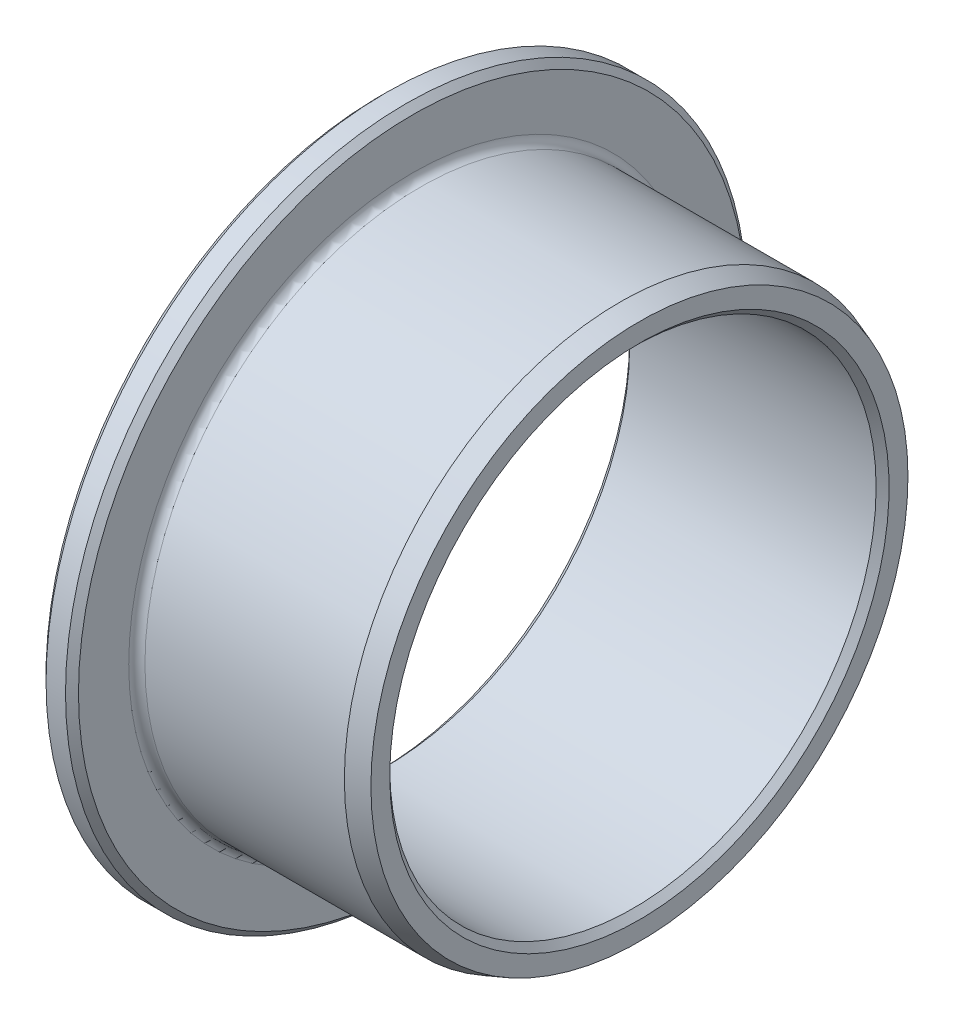
ISO-10303-21;
HEADER;
FILE_DESCRIPTION(('STEP AP214'),'2;1');
FILE_NAME('part.step','',(''),(''),'','','');
FILE_SCHEMA(('AUTOMOTIVE_DESIGN { 1 0 10303 214 1 1 1 1 }'));
ENDSEC;
DATA;
#1=APPLICATION_CONTEXT('core data for automotive mechanical design processes');
#2=APPLICATION_PROTOCOL_DEFINITION('international standard','automotive_design',2000,#1);
#3=PRODUCT_CONTEXT('',#1,'mechanical');
#4=PRODUCT('Part','Part','',(#3));
#5=PRODUCT_RELATED_PRODUCT_CATEGORY('part','',(#4));
#6=PRODUCT_DEFINITION_FORMATION('','',#4);
#7=PRODUCT_DEFINITION_CONTEXT('part definition',#1,'design');
#8=PRODUCT_DEFINITION('design','',#6,#7);
#9=PRODUCT_DEFINITION_SHAPE('','',#8);
#10=(LENGTH_UNIT() NAMED_UNIT(*) SI_UNIT(.MILLI.,.METRE.));
#11=(NAMED_UNIT(*) PLANE_ANGLE_UNIT() SI_UNIT($,.RADIAN.));
#12=(NAMED_UNIT(*) SI_UNIT($,.STERADIAN.) SOLID_ANGLE_UNIT());
#13=UNCERTAINTY_MEASURE_WITH_UNIT(LENGTH_MEASURE(1.E-05),#10,'distance_accuracy_value','');
#14=(GEOMETRIC_REPRESENTATION_CONTEXT(3) GLOBAL_UNCERTAINTY_ASSIGNED_CONTEXT((#13)) GLOBAL_UNIT_ASSIGNED_CONTEXT((#10,
#11,#12)) REPRESENTATION_CONTEXT('',''));
#15=CARTESIAN_POINT('',(0.,0.,0.));
#16=DIRECTION('',(0.,0.,1.));
#17=DIRECTION('',(1.,0.,0.));
#18=AXIS2_PLACEMENT_3D('',#15,#16,#17);
#19=CARTESIAN_POINT('',(0.,21.,0.));
#20=DIRECTION('',(-1.,0.,0.));
#21=DIRECTION('',(0.,0.,1.));
#22=AXIS2_PLACEMENT_3D('',#19,#20,#21);
#23=PLANE('',#22);
#24=CARTESIAN_POINT('',(0.,0.,0.));
#25=DIRECTION('',(-1.,0.,0.));
#26=DIRECTION('',(0.,0.,1.));
#27=AXIS2_PLACEMENT_3D('',#24,#25,#26);
#28=CIRCLE('',#27,20.6);
#29=CARTESIAN_POINT('',(0.,0.,20.6));
#30=VERTEX_POINT('',#29);
#31=EDGE_CURVE('E54',#30,#30,#28,.F.);
#32=ORIENTED_EDGE('',*,*,#31,.T.);
#33=EDGE_LOOP('',(#32));
#34=FACE_BOUND('',#33,.T.);
#35=CARTESIAN_POINT('',(0.,0.,0.));
#36=DIRECTION('',(-1.,0.,0.));
#37=DIRECTION('',(0.,0.,1.));
#38=AXIS2_PLACEMENT_3D('',#35,#36,#37);
#39=CIRCLE('',#38,17.5);
#40=CARTESIAN_POINT('',(0.,0.,17.5));
#41=VERTEX_POINT('',#40);
#42=EDGE_CURVE('E72',#41,#41,#39,.T.);
#43=ORIENTED_EDGE('',*,*,#42,.T.);
#44=EDGE_LOOP('',(#43));
#45=FACE_BOUND('',#44,.T.);
#46=ADVANCED_FACE('F32',(#34,#45),#23,.F.);
#47=CARTESIAN_POINT('',(-5.31268266176283,0.,0.));
#48=DIRECTION('',(-1.,0.,0.));
#49=DIRECTION('',(0.,0.,1.));
#50=AXIS2_PLACEMENT_3D('',#47,#48,#49);
#51=CYLINDRICAL_SURFACE('',#50,17.);
#52=CARTESIAN_POINT('',(12.8,0.,0.));
#53=DIRECTION('',(-1.,0.,0.));
#54=DIRECTION('',(0.,0.,1.));
#55=AXIS2_PLACEMENT_3D('',#52,#53,#54);
#56=CIRCLE('',#55,17.);
#57=CARTESIAN_POINT('',(12.8,0.,17.));
#58=VERTEX_POINT('',#57);
#59=EDGE_CURVE('E38',#58,#58,#56,.T.);
#60=ORIENTED_EDGE('',*,*,#59,.T.);
#61=EDGE_LOOP('',(#60));
#62=FACE_BOUND('',#61,.T.);
#63=CARTESIAN_POINT('',(0.5,0.,0.));
#64=DIRECTION('',(-1.,0.,0.));
#65=DIRECTION('',(0.,0.,1.));
#66=AXIS2_PLACEMENT_3D('',#63,#64,#65);
#67=CIRCLE('',#66,17.);
#68=CARTESIAN_POINT('',(0.5,0.,17.));
#69=VERTEX_POINT('',#68);
#70=EDGE_CURVE('E69',#69,#69,#67,.F.);
#71=ORIENTED_EDGE('',*,*,#70,.T.);
#72=EDGE_LOOP('',(#71));
#73=FACE_BOUND('',#72,.T.);
#74=ADVANCED_FACE('F95',(#62,#73),#51,.T.);
#75=CARTESIAN_POINT('',(14.,17.,0.));
#76=DIRECTION('',(-1.,0.,0.));
#77=DIRECTION('',(0.,0.,1.));
#78=AXIS2_PLACEMENT_3D('',#75,#76,#77);
#79=PLANE('',#78);
#80=CARTESIAN_POINT('',(14.,0.,0.));
#81=DIRECTION('',(-1.,0.,0.));
#82=DIRECTION('',(0.,0.,1.));
#83=AXIS2_PLACEMENT_3D('',#80,#81,#82);
#84=CIRCLE('',#83,16.5632357188806);
#85=CARTESIAN_POINT('',(14.,0.,16.5632357188806));
#86=VERTEX_POINT('',#85);
#87=EDGE_CURVE('E10',#86,#86,#84,.F.);
#88=ORIENTED_EDGE('',*,*,#87,.T.);
#89=EDGE_LOOP('',(#88));
#90=FACE_BOUND('',#89,.T.);
#91=CARTESIAN_POINT('',(14.,0.,0.));
#92=DIRECTION('',(-1.,0.,0.));
#93=DIRECTION('',(0.,0.,1.));
#94=AXIS2_PLACEMENT_3D('',#91,#92,#93);
#95=CIRCLE('',#94,15.4);
#96=CARTESIAN_POINT('',(14.,0.,15.4));
#97=VERTEX_POINT('',#96);
#98=EDGE_CURVE('E51',#97,#97,#95,.T.);
#99=ORIENTED_EDGE('',*,*,#98,.T.);
#100=EDGE_LOOP('',(#99));
#101=FACE_BOUND('',#100,.T.);
#102=ADVANCED_FACE('F100',(#90,#101),#79,.F.);
#103=CARTESIAN_POINT('',(-5.31268266176283,0.,0.));
#104=DIRECTION('',(-1.,0.,0.));
#105=DIRECTION('',(0.,0.,1.));
#106=AXIS2_PLACEMENT_3D('',#103,#104,#105);
#107=CYLINDRICAL_SURFACE('',#106,15.);
#108=CARTESIAN_POINT('',(13.6,0.,0.));
#109=DIRECTION('',(-1.,0.,0.));
#110=DIRECTION('',(0.,0.,1.));
#111=AXIS2_PLACEMENT_3D('',#108,#109,#110);
#112=CIRCLE('',#111,15.);
#113=CARTESIAN_POINT('',(13.6,0.,15.));
#114=VERTEX_POINT('',#113);
#115=EDGE_CURVE('E42',#114,#114,#112,.F.);
#116=ORIENTED_EDGE('',*,*,#115,.T.);
#117=EDGE_LOOP('',(#116));
#118=FACE_BOUND('',#117,.T.);
#119=CARTESIAN_POINT('',(-1.60000000000001,0.,0.));
#120=DIRECTION('',(1.,0.,0.));
#121=DIRECTION('',(0.,0.,-1.));
#122=AXIS2_PLACEMENT_3D('',#119,#120,#121);
#123=CIRCLE('',#122,15.);
#124=CARTESIAN_POINT('',(-1.60000000000001,0.,-15.));
#125=VERTEX_POINT('',#124);
#126=EDGE_CURVE('E46',#125,#125,#123,.F.);
#127=ORIENTED_EDGE('',*,*,#126,.T.);
#128=EDGE_LOOP('',(#127));
#129=FACE_BOUND('',#128,.T.);
#130=ADVANCED_FACE('F161',(#118,#129),#107,.F.);
#131=CARTESIAN_POINT('',(-2.,15.,0.));
#132=DIRECTION('',(1.,0.,0.));
#133=DIRECTION('',(0.,0.,-1.));
#134=AXIS2_PLACEMENT_3D('',#131,#132,#133);
#135=PLANE('',#134);
#136=CARTESIAN_POINT('',(-2.,0.,0.));
#137=DIRECTION('',(1.,0.,0.));
#138=DIRECTION('',(0.,0.,-1.));
#139=AXIS2_PLACEMENT_3D('',#136,#137,#138);
#140=CIRCLE('',#139,20.6);
#141=CARTESIAN_POINT('',(-2.,0.,-20.6));
#142=VERTEX_POINT('',#141);
#143=EDGE_CURVE('E63',#142,#142,#140,.F.);
#144=ORIENTED_EDGE('',*,*,#143,.T.);
#145=EDGE_LOOP('',(#144));
#146=FACE_BOUND('',#145,.T.);
#147=CARTESIAN_POINT('',(-2.,0.,0.));
#148=DIRECTION('',(1.,0.,0.));
#149=DIRECTION('',(0.,0.,-1.));
#150=AXIS2_PLACEMENT_3D('',#147,#148,#149);
#151=CIRCLE('',#150,15.4);
#152=CARTESIAN_POINT('',(-2.,0.,-15.4));
#153=VERTEX_POINT('',#152);
#154=EDGE_CURVE('E66',#153,#153,#151,.T.);
#155=ORIENTED_EDGE('',*,*,#154,.T.);
#156=EDGE_LOOP('',(#155));
#157=FACE_BOUND('',#156,.T.);
#158=ADVANCED_FACE('F90',(#146,#157),#135,.F.);
#159=CARTESIAN_POINT('',(-5.31268266176283,0.,0.));
#160=DIRECTION('',(-1.,0.,0.));
#161=DIRECTION('',(0.,0.,1.));
#162=AXIS2_PLACEMENT_3D('',#159,#160,#161);
#163=CYLINDRICAL_SURFACE('',#162,21.);
#164=CARTESIAN_POINT('',(-1.6,0.,0.));
#165=DIRECTION('',(1.,0.,0.));
#166=DIRECTION('',(0.,0.,-1.));
#167=AXIS2_PLACEMENT_3D('',#164,#165,#166);
#168=CIRCLE('',#167,21.);
#169=CARTESIAN_POINT('',(-1.6,0.,-21.));
#170=VERTEX_POINT('',#169);
#171=EDGE_CURVE('E57',#170,#170,#168,.T.);
#172=ORIENTED_EDGE('',*,*,#171,.T.);
#173=EDGE_LOOP('',(#172));
#174=FACE_BOUND('',#173,.T.);
#175=CARTESIAN_POINT('',(-0.400000000000001,0.,0.));
#176=DIRECTION('',(-1.,0.,0.));
#177=DIRECTION('',(0.,0.,1.));
#178=AXIS2_PLACEMENT_3D('',#175,#176,#177);
#179=CIRCLE('',#178,21.);
#180=CARTESIAN_POINT('',(-0.400000000000001,0.,21.));
#181=VERTEX_POINT('',#180);
#182=EDGE_CURVE('E60',#181,#181,#179,.T.);
#183=ORIENTED_EDGE('',*,*,#182,.T.);
#184=EDGE_LOOP('',(#183));
#185=FACE_BOUND('',#184,.T.);
#186=ADVANCED_FACE('F80',(#174,#185),#163,.T.);
#187=CARTESIAN_POINT('',(0.5,0.,0.));
#188=DIRECTION('',(-1.,0.,0.));
#189=DIRECTION('',(0.,0.,1.));
#190=AXIS2_PLACEMENT_3D('',#187,#188,#189);
#191=TOROIDAL_SURFACE('',#190,17.5,0.5);
#192=ORIENTED_EDGE('',*,*,#70,.F.);
#193=EDGE_LOOP('',(#192));
#194=FACE_BOUND('',#193,.T.);
#195=ORIENTED_EDGE('',*,*,#42,.F.);
#196=EDGE_LOOP('',(#195));
#197=FACE_BOUND('',#196,.T.);
#198=ADVANCED_FACE('F77',(#194,#197),#191,.F.);
#199=CARTESIAN_POINT('',(-2.,0.,0.));
#200=DIRECTION('',(1.,0.,0.));
#201=DIRECTION('',(0.,0.,-1.));
#202=AXIS2_PLACEMENT_3D('',#199,#200,#201);
#203=CONICAL_SURFACE('',#202,20.6,0.78539816339745);
#204=CARTESIAN_POINT('',(-1.6,0.,-21.));
#205=CARTESIAN_POINT('',(-1.60416666666667,0.,-20.9958333333333));
#206=CARTESIAN_POINT('',(-1.60833333333334,0.,-20.9916666666667));
#207=CARTESIAN_POINT('',(-1.61666666666667,0.,-20.9833333333333));
#208=CARTESIAN_POINT('',(-1.62083333333334,0.,-20.9791666666667));
#209=CARTESIAN_POINT('',(-1.62916666666667,0.,-20.9708333333333));
#210=CARTESIAN_POINT('',(-1.63333333333334,0.,-20.9666666666667));
#211=CARTESIAN_POINT('',(-1.64166666666667,0.,-20.9583333333333));
#212=CARTESIAN_POINT('',(-1.64583333333334,0.,-20.9541666666667));
#213=CARTESIAN_POINT('',(-1.65416666666667,0.,-20.9458333333333));
#214=CARTESIAN_POINT('',(-1.65833333333334,0.,-20.9416666666667));
#215=CARTESIAN_POINT('',(-1.66666666666667,0.,-20.9333333333333));
#216=CARTESIAN_POINT('',(-1.67083333333334,0.,-20.9291666666667));
#217=CARTESIAN_POINT('',(-1.67916666666667,0.,-20.9208333333333));
#218=CARTESIAN_POINT('',(-1.68333333333334,0.,-20.9166666666667));
#219=CARTESIAN_POINT('',(-1.69166666666667,0.,-20.9083333333333));
#220=CARTESIAN_POINT('',(-1.69583333333334,0.,-20.9041666666667));
#221=CARTESIAN_POINT('',(-1.70416666666667,0.,-20.8958333333333));
#222=CARTESIAN_POINT('',(-1.70833333333334,0.,-20.8916666666667));
#223=CARTESIAN_POINT('',(-1.71666666666667,0.,-20.8833333333333));
#224=CARTESIAN_POINT('',(-1.72083333333334,0.,-20.8791666666667));
#225=CARTESIAN_POINT('',(-1.72916666666667,0.,-20.8708333333333));
#226=CARTESIAN_POINT('',(-1.73333333333334,0.,-20.8666666666667));
#227=CARTESIAN_POINT('',(-1.74166666666667,0.,-20.8583333333333));
#228=CARTESIAN_POINT('',(-1.74583333333334,0.,-20.8541666666667));
#229=CARTESIAN_POINT('',(-1.75416666666667,0.,-20.8458333333333));
#230=CARTESIAN_POINT('',(-1.75833333333334,0.,-20.8416666666667));
#231=CARTESIAN_POINT('',(-1.76666666666667,0.,-20.8333333333333));
#232=CARTESIAN_POINT('',(-1.77083333333334,0.,-20.8291666666667));
#233=CARTESIAN_POINT('',(-1.77916666666667,0.,-20.8208333333333));
#234=CARTESIAN_POINT('',(-1.78333333333334,0.,-20.8166666666667));
#235=CARTESIAN_POINT('',(-1.79166666666667,0.,-20.8083333333333));
#236=CARTESIAN_POINT('',(-1.79583333333334,0.,-20.8041666666667));
#237=CARTESIAN_POINT('',(-1.80416666666667,0.,-20.7958333333333));
#238=CARTESIAN_POINT('',(-1.80833333333334,0.,-20.7916666666667));
#239=CARTESIAN_POINT('',(-1.81666666666667,0.,-20.7833333333333));
#240=CARTESIAN_POINT('',(-1.82083333333334,0.,-20.7791666666667));
#241=CARTESIAN_POINT('',(-1.82916666666667,0.,-20.7708333333333));
#242=CARTESIAN_POINT('',(-1.83333333333334,0.,-20.7666666666667));
#243=CARTESIAN_POINT('',(-1.84166666666667,0.,-20.7583333333333));
#244=CARTESIAN_POINT('',(-1.84583333333334,0.,-20.7541666666667));
#245=CARTESIAN_POINT('',(-1.85416666666667,0.,-20.7458333333333));
#246=CARTESIAN_POINT('',(-1.85833333333334,0.,-20.7416666666667));
#247=CARTESIAN_POINT('',(-1.86666666666667,0.,-20.7333333333333));
#248=CARTESIAN_POINT('',(-1.87083333333334,0.,-20.7291666666667));
#249=CARTESIAN_POINT('',(-1.87916666666667,0.,-20.7208333333333));
#250=CARTESIAN_POINT('',(-1.88333333333334,0.,-20.7166666666667));
#251=CARTESIAN_POINT('',(-1.89166666666667,0.,-20.7083333333333));
#252=CARTESIAN_POINT('',(-1.89583333333334,0.,-20.7041666666667));
#253=CARTESIAN_POINT('',(-1.90416666666667,0.,-20.6958333333333));
#254=CARTESIAN_POINT('',(-1.90833333333334,0.,-20.6916666666667));
#255=CARTESIAN_POINT('',(-1.91666666666667,0.,-20.6833333333333));
#256=CARTESIAN_POINT('',(-1.92083333333334,0.,-20.6791666666667));
#257=CARTESIAN_POINT('',(-1.92916666666667,0.,-20.6708333333333));
#258=CARTESIAN_POINT('',(-1.93333333333334,0.,-20.6666666666667));
#259=CARTESIAN_POINT('',(-1.94166666666667,0.,-20.6583333333333));
#260=CARTESIAN_POINT('',(-1.94583333333334,0.,-20.6541666666667));
#261=CARTESIAN_POINT('',(-1.95416666666667,0.,-20.6458333333333));
#262=CARTESIAN_POINT('',(-1.95833333333334,0.,-20.6416666666667));
#263=CARTESIAN_POINT('',(-1.96666666666667,0.,-20.6333333333333));
#264=CARTESIAN_POINT('',(-1.97083333333334,0.,-20.6291666666667));
#265=CARTESIAN_POINT('',(-1.97916666666667,0.,-20.6208333333333));
#266=CARTESIAN_POINT('',(-1.98333333333334,0.,-20.6166666666667));
#267=CARTESIAN_POINT('',(-1.99166666666667,0.,-20.6083333333333));
#268=CARTESIAN_POINT('',(-1.99583333333334,0.,-20.6041666666667));
#269=CARTESIAN_POINT('',(-2.,0.,-20.6));
#270=B_SPLINE_CURVE_WITH_KNOTS('',3,(#204,#205,#206,#207,#208,#209,#210,#211,#212,#213,#214,
#215,#216,#217,#218,#219,#220,#221,#222,#223,#224,#225,#226,#227,#228,#229,#230,#231,#232,#233,
#234,#235,#236,#237,#238,#239,#240,#241,#242,#243,#244,#245,#246,#247,#248,#249,#250,#251,#252,
#253,#254,#255,#256,#257,#258,#259,#260,#261,#262,#263,#264,#265,#266,#267,#268,#269),
.UNSPECIFIED.,.F.,.F.,(4,2,2,2,2,2,2,2,2,2,2,2,2,2,2,2,2,2,2,2,2,2,2,2,2,2,2,2,2,2,2,2,4),(0.,
0.0176776695296627,0.0353553390593279,0.0530330085889906,0.0707106781186557,0.0883883476483184,
0.106066017177981,0.123743686707646,0.141421356237309,0.159099025766974,0.176776695296637,
0.194454364826302,0.212132034355965,0.229809703885627,0.247487373415293,0.265165042944955,
0.282842712474621,0.300520382004283,0.318198051533946,0.335875721063611,0.353553390593274,
0.371231060122939,0.388908729652602,0.406586399182264,0.42426406871193,0.441941738241592,
0.459619407771258,0.47729707730092,0.494974746830583,0.512652416360248,0.530330085889911,
0.548007755419576,0.565685424949239),.UNSPECIFIED.);
#271=EDGE_CURVE('BSEAM79',#170,#142,#270,.T.);
#272=ORIENTED_EDGE('',*,*,#171,.F.);
#273=ORIENTED_EDGE('',*,*,#143,.F.);
#274=ORIENTED_EDGE('',*,*,#271,.T.);
#275=ORIENTED_EDGE('',*,*,#271,.F.);
#276=EDGE_LOOP('',(#272,#274,#273,#275));
#277=FACE_BOUND('',#276,.T.);
#278=ADVANCED_FACE('F79',(#277),#203,.T.);
#279=CARTESIAN_POINT('',(-0.400000000000001,0.,0.));
#280=DIRECTION('',(-1.,0.,0.));
#281=DIRECTION('',(0.,0.,1.));
#282=AXIS2_PLACEMENT_3D('',#279,#280,#281);
#283=CONICAL_SURFACE('',#282,21.,0.785398163397453);
#284=ORIENTED_EDGE('',*,*,#31,.F.);
#285=EDGE_LOOP('',(#284));
#286=FACE_BOUND('',#285,.T.);
#287=ORIENTED_EDGE('',*,*,#182,.F.);
#288=EDGE_LOOP('',(#287));
#289=FACE_BOUND('',#288,.T.);
#290=ADVANCED_FACE('F87',(#286,#289),#283,.T.);
#291=CARTESIAN_POINT('',(14.,0.,0.));
#292=DIRECTION('',(1.,0.,0.));
#293=DIRECTION('',(0.,0.,-1.));
#294=AXIS2_PLACEMENT_3D('',#291,#292,#293);
#295=CONICAL_SURFACE('',#294,15.4,0.785398163397442);
#296=ORIENTED_EDGE('',*,*,#115,.F.);
#297=EDGE_LOOP('',(#296));
#298=FACE_BOUND('',#297,.T.);
#299=ORIENTED_EDGE('',*,*,#98,.F.);
#300=EDGE_LOOP('',(#299));
#301=FACE_BOUND('',#300,.T.);
#302=ADVANCED_FACE('F105',(#298,#301),#295,.F.);
#303=CARTESIAN_POINT('',(-1.60000000000001,0.,0.));
#304=DIRECTION('',(-1.,0.,0.));
#305=DIRECTION('',(0.,0.,1.));
#306=AXIS2_PLACEMENT_3D('',#303,#304,#305);
#307=CONICAL_SURFACE('',#306,15.,0.78539816339745);
#308=ORIENTED_EDGE('',*,*,#154,.F.);
#309=EDGE_LOOP('',(#308));
#310=FACE_BOUND('',#309,.T.);
#311=ORIENTED_EDGE('',*,*,#126,.F.);
#312=EDGE_LOOP('',(#311));
#313=FACE_BOUND('',#312,.T.);
#314=ADVANCED_FACE('F112',(#310,#313),#307,.F.);
#315=CARTESIAN_POINT('',(12.8,0.,0.));
#316=DIRECTION('',(-1.,0.,0.));
#317=DIRECTION('',(0.,0.,1.));
#318=AXIS2_PLACEMENT_3D('',#315,#316,#317);
#319=CONICAL_SURFACE('',#318,17.,0.349065850398864);
#320=ORIENTED_EDGE('',*,*,#87,.F.);
#321=EDGE_LOOP('',(#320));
#322=FACE_BOUND('',#321,.T.);
#323=ORIENTED_EDGE('',*,*,#59,.F.);
#324=EDGE_LOOP('',(#323));
#325=FACE_BOUND('',#324,.T.);
#326=ADVANCED_FACE('F118',(#322,#325),#319,.T.);
#327=CLOSED_SHELL('',(#46,#74,#102,#130,#158,#186,#198,#278,#290,#302,#314,#326));
#328=MANIFOLD_SOLID_BREP('B2',#327);
#329=ADVANCED_BREP_SHAPE_REPRESENTATION('',(#18,#328),#14);
#330=SHAPE_DEFINITION_REPRESENTATION(#9,#329);
ENDSEC;
END-ISO-10303-21;
